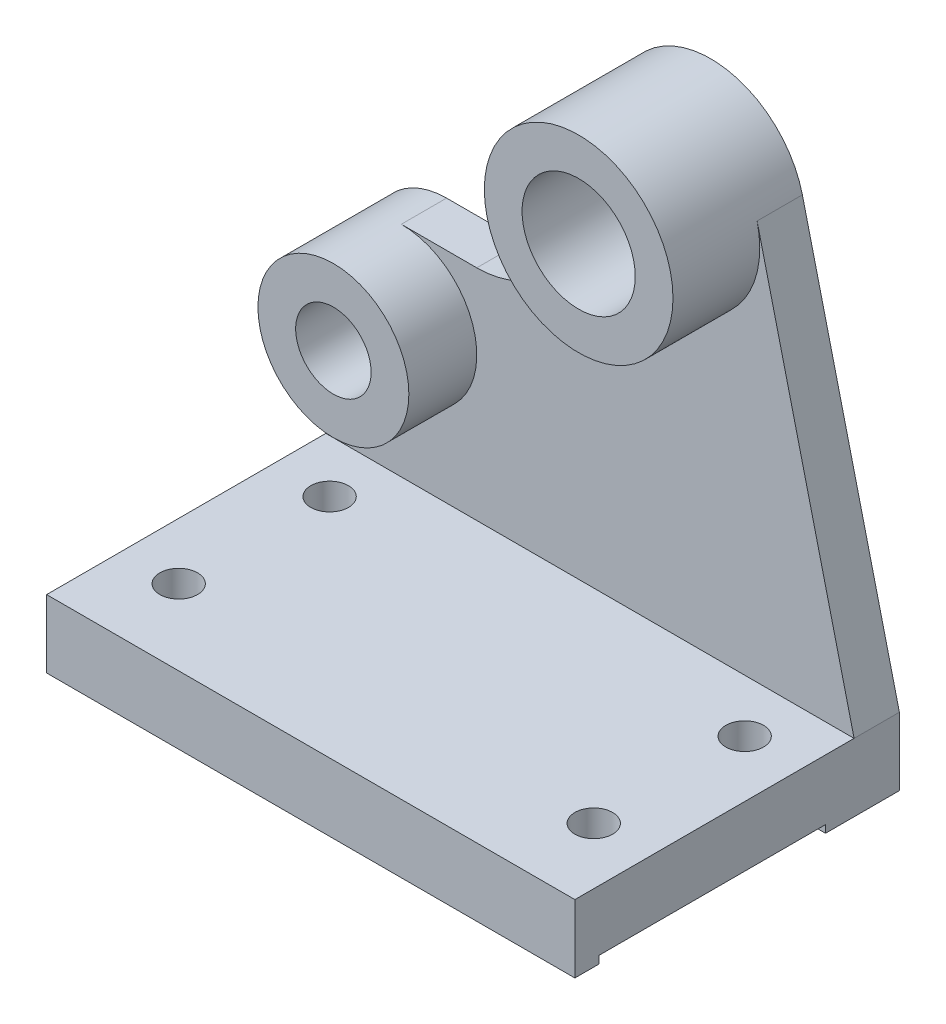
ISO-10303-21;
HEADER;
FILE_DESCRIPTION(('STEP AP214'),'2;1');
FILE_NAME('part.step','',(''),(''),'','','');
FILE_SCHEMA(('AUTOMOTIVE_DESIGN { 1 0 10303 214 1 1 1 1 }'));
ENDSEC;
DATA;
#1=APPLICATION_CONTEXT('core data for automotive mechanical design processes');
#2=APPLICATION_PROTOCOL_DEFINITION('international standard','automotive_design',2000,#1);
#3=PRODUCT_CONTEXT('',#1,'mechanical');
#4=PRODUCT('Part','Part','',(#3));
#5=PRODUCT_RELATED_PRODUCT_CATEGORY('part','',(#4));
#6=PRODUCT_DEFINITION_FORMATION('','',#4);
#7=PRODUCT_DEFINITION_CONTEXT('part definition',#1,'design');
#8=PRODUCT_DEFINITION('design','',#6,#7);
#9=PRODUCT_DEFINITION_SHAPE('','',#8);
#10=(LENGTH_UNIT() NAMED_UNIT(*) SI_UNIT(.MILLI.,.METRE.));
#11=(NAMED_UNIT(*) PLANE_ANGLE_UNIT() SI_UNIT($,.RADIAN.));
#12=(NAMED_UNIT(*) SI_UNIT($,.STERADIAN.) SOLID_ANGLE_UNIT());
#13=UNCERTAINTY_MEASURE_WITH_UNIT(LENGTH_MEASURE(1.E-05),#10,'distance_accuracy_value','');
#14=(GEOMETRIC_REPRESENTATION_CONTEXT(3) GLOBAL_UNCERTAINTY_ASSIGNED_CONTEXT((#13)) GLOBAL_UNIT_ASSIGNED_CONTEXT((#10,
#11,#12)) REPRESENTATION_CONTEXT('',''));
#15=CARTESIAN_POINT('',(0.,0.,0.));
#16=DIRECTION('',(0.,0.,1.));
#17=DIRECTION('',(1.,0.,0.));
#18=AXIS2_PLACEMENT_3D('',#15,#16,#17);
#19=CARTESIAN_POINT('',(-70.,-18.,86.));
#20=DIRECTION('',(0.,1.,0.));
#21=DIRECTION('',(0.,0.,1.));
#22=AXIS2_PLACEMENT_3D('',#19,#20,#21);
#23=PLANE('',#22);
#24=DIRECTION('',(0.,0.,-1.));
#25=VECTOR('',#24,1.);
#26=CARTESIAN_POINT('',(-70.,-18.,86.));
#27=LINE('',#26,#25);
#28=CARTESIAN_POINT('',(-70.,-18.,86.));
#29=VERTEX_POINT('',#28);
#30=CARTESIAN_POINT('',(-70.,-18.,79.5757049373885));
#31=VERTEX_POINT('',#30);
#32=EDGE_CURVE('E184',#29,#31,#27,.T.);
#33=ORIENTED_EDGE('',*,*,#32,.T.);
#34=DIRECTION('',(1.,0.,0.));
#35=VECTOR('',#34,1.);
#36=CARTESIAN_POINT('',(-70.,-18.,79.5757049373885));
#37=LINE('',#36,#35);
#38=CARTESIAN_POINT('',(70.,-18.,79.5757049373885));
#39=VERTEX_POINT('',#38);
#40=EDGE_CURVE('E11',#31,#39,#37,.T.);
#41=ORIENTED_EDGE('',*,*,#40,.T.);
#42=DIRECTION('',(0.,0.,-1.));
#43=VECTOR('',#42,1.);
#44=CARTESIAN_POINT('',(70.,-18.,86.));
#45=LINE('',#44,#43);
#46=CARTESIAN_POINT('',(70.,-18.,86.));
#47=VERTEX_POINT('',#46);
#48=EDGE_CURVE('E349',#47,#39,#45,.T.);
#49=ORIENTED_EDGE('',*,*,#48,.F.);
#50=DIRECTION('',(1.,0.,0.));
#51=VECTOR('',#50,1.);
#52=CARTESIAN_POINT('',(-70.,-18.,86.));
#53=LINE('',#52,#51);
#54=EDGE_CURVE('E322',#29,#47,#53,.T.);
#55=ORIENTED_EDGE('',*,*,#54,.F.);
#56=EDGE_LOOP('',(#33,#41,#49,#55));
#57=FACE_BOUND('',#56,.T.);
#58=ADVANCED_FACE('F44',(#57),#23,.F.);
#59=CARTESIAN_POINT('',(70.,0.,86.));
#60=DIRECTION('',(-1.,0.,0.));
#61=DIRECTION('',(0.,0.,1.));
#62=AXIS2_PLACEMENT_3D('',#59,#60,#61);
#63=PLANE('',#62);
#64=DIRECTION('',(0.,-1.,0.));
#65=VECTOR('',#64,1.);
#66=CARTESIAN_POINT('',(70.,-16.,79.5757049373885));
#67=LINE('',#66,#65);
#68=CARTESIAN_POINT('',(70.,-16.,79.5757049373885));
#69=VERTEX_POINT('',#68);
#70=EDGE_CURVE('E176',#69,#39,#67,.T.);
#71=ORIENTED_EDGE('',*,*,#70,.F.);
#72=DIRECTION('',(0.,0.,1.));
#73=VECTOR('',#72,1.);
#74=CARTESIAN_POINT('',(70.,-16.,79.5757049373885));
#75=LINE('',#74,#73);
#76=CARTESIAN_POINT('',(70.,-16.,19.5757049373885));
#77=VERTEX_POINT('',#76);
#78=EDGE_CURVE('E177',#77,#69,#75,.T.);
#79=ORIENTED_EDGE('',*,*,#78,.F.);
#80=DIRECTION('',(0.,1.,0.));
#81=VECTOR('',#80,1.);
#82=CARTESIAN_POINT('',(70.,-16.,19.5757049373885));
#83=LINE('',#82,#81);
#84=CARTESIAN_POINT('',(70.,-18.,19.5757049373885));
#85=VERTEX_POINT('',#84);
#86=EDGE_CURVE('E154',#85,#77,#83,.T.);
#87=ORIENTED_EDGE('',*,*,#86,.F.);
#88=CARTESIAN_POINT('',(70.,-18.,0.));
#89=VERTEX_POINT('',#88);
#90=EDGE_CURVE('E346',#85,#89,#45,.T.);
#91=ORIENTED_EDGE('',*,*,#90,.T.);
#92=DIRECTION('',(0.,1.,0.));
#93=VECTOR('',#92,1.);
#94=CARTESIAN_POINT('',(70.,0.,0.));
#95=LINE('',#94,#93);
#96=CARTESIAN_POINT('',(70.,0.,0.));
#97=VERTEX_POINT('',#96);
#98=EDGE_CURVE('E324',#89,#97,#95,.T.);
#99=ORIENTED_EDGE('',*,*,#98,.T.);
#100=DIRECTION('',(0.,0.,-1.));
#101=VECTOR('',#100,1.);
#102=CARTESIAN_POINT('',(70.,0.,12.));
#103=LINE('',#102,#101);
#104=CARTESIAN_POINT('',(70.,0.,12.));
#105=VERTEX_POINT('',#104);
#106=EDGE_CURVE('E301',#105,#97,#103,.T.);
#107=ORIENTED_EDGE('',*,*,#106,.F.);
#108=DIRECTION('',(0.,0.,-1.));
#109=VECTOR('',#108,1.);
#110=CARTESIAN_POINT('',(70.,0.,86.));
#111=LINE('',#110,#109);
#112=CARTESIAN_POINT('',(70.,0.,86.));
#113=VERTEX_POINT('',#112);
#114=EDGE_CURVE('E343',#113,#105,#111,.T.);
#115=ORIENTED_EDGE('',*,*,#114,.F.);
#116=DIRECTION('',(0.,1.,0.));
#117=VECTOR('',#116,1.);
#118=CARTESIAN_POINT('',(70.,0.,86.));
#119=LINE('',#118,#117);
#120=EDGE_CURVE('E327',#47,#113,#119,.T.);
#121=ORIENTED_EDGE('',*,*,#120,.F.);
#122=ORIENTED_EDGE('',*,*,#48,.T.);
#123=EDGE_LOOP('',(#71,#79,#87,#91,#99,#107,#115,#121,#122));
#124=FACE_BOUND('',#123,.T.);
#125=ADVANCED_FACE('F364',(#124),#63,.F.);
#126=CARTESIAN_POINT('',(-70.,0.,86.));
#127=DIRECTION('',(0.,-1.,0.));
#128=DIRECTION('',(0.,0.,-1.));
#129=AXIS2_PLACEMENT_3D('',#126,#127,#128);
#130=PLANE('',#129);
#131=CARTESIAN_POINT('',(55.,0.,66.));
#132=DIRECTION('',(0.,1.,0.));
#133=DIRECTION('',(0.,0.,1.));
#134=AXIS2_PLACEMENT_3D('',#131,#132,#133);
#135=CIRCLE('',#134,5.);
#136=CARTESIAN_POINT('',(55.,0.,71.));
#137=VERTEX_POINT('',#136);
#138=EDGE_CURVE('E205',#137,#137,#135,.T.);
#139=ORIENTED_EDGE('',*,*,#138,.F.);
#140=EDGE_LOOP('',(#139));
#141=FACE_BOUND('',#140,.T.);
#142=CARTESIAN_POINT('',(55.,0.,26.));
#143=DIRECTION('',(0.,1.,0.));
#144=DIRECTION('',(0.,0.,1.));
#145=AXIS2_PLACEMENT_3D('',#142,#143,#144);
#146=CIRCLE('',#145,5.);
#147=CARTESIAN_POINT('',(55.,0.,31.));
#148=VERTEX_POINT('',#147);
#149=EDGE_CURVE('E208',#148,#148,#146,.T.);
#150=ORIENTED_EDGE('',*,*,#149,.F.);
#151=EDGE_LOOP('',(#150));
#152=FACE_BOUND('',#151,.T.);
#153=CARTESIAN_POINT('',(-55.,0.,26.));
#154=DIRECTION('',(0.,1.,0.));
#155=DIRECTION('',(0.,0.,1.));
#156=AXIS2_PLACEMENT_3D('',#153,#154,#155);
#157=CIRCLE('',#156,5.);
#158=CARTESIAN_POINT('',(-55.,0.,31.));
#159=VERTEX_POINT('',#158);
#160=EDGE_CURVE('E201',#159,#159,#157,.T.);
#161=ORIENTED_EDGE('',*,*,#160,.F.);
#162=EDGE_LOOP('',(#161));
#163=FACE_BOUND('',#162,.T.);
#164=CARTESIAN_POINT('',(-55.,0.,66.));
#165=DIRECTION('',(0.,1.,0.));
#166=DIRECTION('',(0.,0.,1.));
#167=AXIS2_PLACEMENT_3D('',#164,#165,#166);
#168=CIRCLE('',#167,5.);
#169=CARTESIAN_POINT('',(-55.,0.,71.));
#170=VERTEX_POINT('',#169);
#171=EDGE_CURVE('E210',#170,#170,#168,.T.);
#172=ORIENTED_EDGE('',*,*,#171,.F.);
#173=EDGE_LOOP('',(#172));
#174=FACE_BOUND('',#173,.T.);
#175=DIRECTION('',(1.,0.,0.));
#176=VECTOR('',#175,1.);
#177=CARTESIAN_POINT('',(0.,0.,12.));
#178=LINE('',#177,#176);
#179=CARTESIAN_POINT('',(-70.,0.,12.));
#180=VERTEX_POINT('',#179);
#181=EDGE_CURVE('E66',#180,#105,#178,.T.);
#182=ORIENTED_EDGE('',*,*,#181,.F.);
#183=DIRECTION('',(0.,0.,-1.));
#184=VECTOR('',#183,1.);
#185=CARTESIAN_POINT('',(-70.,0.,86.));
#186=LINE('',#185,#184);
#187=CARTESIAN_POINT('',(-70.,0.,86.));
#188=VERTEX_POINT('',#187);
#189=EDGE_CURVE('E331',#188,#180,#186,.T.);
#190=ORIENTED_EDGE('',*,*,#189,.F.);
#191=DIRECTION('',(-1.,0.,0.));
#192=VECTOR('',#191,1.);
#193=CARTESIAN_POINT('',(-70.,0.,86.));
#194=LINE('',#193,#192);
#195=EDGE_CURVE('E332',#113,#188,#194,.T.);
#196=ORIENTED_EDGE('',*,*,#195,.F.);
#197=ORIENTED_EDGE('',*,*,#114,.T.);
#198=EDGE_LOOP('',(#182,#190,#196,#197));
#199=FACE_BOUND('',#198,.T.);
#200=ADVANCED_FACE('F378',(#141,#152,#163,#174,#199),#130,.F.);
#201=CARTESIAN_POINT('',(-70.,0.,86.));
#202=DIRECTION('',(1.,0.,0.));
#203=DIRECTION('',(0.,0.,-1.));
#204=AXIS2_PLACEMENT_3D('',#201,#202,#203);
#205=PLANE('',#204);
#206=DIRECTION('',(0.,0.,1.));
#207=VECTOR('',#206,1.);
#208=CARTESIAN_POINT('',(-70.,-16.,79.5757049373885));
#209=LINE('',#208,#207);
#210=CARTESIAN_POINT('',(-70.,-16.,19.5757049373885));
#211=VERTEX_POINT('',#210);
#212=CARTESIAN_POINT('',(-70.,-16.,79.5757049373885));
#213=VERTEX_POINT('',#212);
#214=EDGE_CURVE('E157',#211,#213,#209,.T.);
#215=ORIENTED_EDGE('',*,*,#214,.T.);
#216=DIRECTION('',(0.,-1.,0.));
#217=VECTOR('',#216,1.);
#218=CARTESIAN_POINT('',(-70.,-16.,79.5757049373885));
#219=LINE('',#218,#217);
#220=EDGE_CURVE('E172',#213,#31,#219,.T.);
#221=ORIENTED_EDGE('',*,*,#220,.T.);
#222=ORIENTED_EDGE('',*,*,#32,.F.);
#223=DIRECTION('',(0.,-1.,0.));
#224=VECTOR('',#223,1.);
#225=CARTESIAN_POINT('',(-70.,0.,86.));
#226=LINE('',#225,#224);
#227=EDGE_CURVE('E319',#188,#29,#226,.T.);
#228=ORIENTED_EDGE('',*,*,#227,.F.);
#229=ORIENTED_EDGE('',*,*,#189,.T.);
#230=DIRECTION('',(0.,1.,0.));
#231=VECTOR('',#230,1.);
#232=CARTESIAN_POINT('',(-70.,0.,12.));
#233=LINE('',#232,#231);
#234=CARTESIAN_POINT('',(-70.,38.,12.));
#235=VERTEX_POINT('',#234);
#236=EDGE_CURVE('E262',#180,#235,#233,.T.);
#237=ORIENTED_EDGE('',*,*,#236,.T.);
#238=DIRECTION('',(0.,0.,-1.));
#239=VECTOR('',#238,1.);
#240=CARTESIAN_POINT('',(-70.,38.,12.));
#241=LINE('',#240,#239);
#242=CARTESIAN_POINT('',(-70.,38.,0.));
#243=VERTEX_POINT('',#242);
#244=EDGE_CURVE('E306',#235,#243,#241,.T.);
#245=ORIENTED_EDGE('',*,*,#244,.T.);
#246=DIRECTION('',(0.,-1.,0.));
#247=VECTOR('',#246,1.);
#248=CARTESIAN_POINT('',(-70.,0.,0.));
#249=LINE('',#248,#247);
#250=CARTESIAN_POINT('',(-70.,-18.,0.));
#251=VERTEX_POINT('',#250);
#252=EDGE_CURVE('E317',#243,#251,#249,.T.);
#253=ORIENTED_EDGE('',*,*,#252,.T.);
#254=CARTESIAN_POINT('',(-70.,-18.,19.5757049373885));
#255=VERTEX_POINT('',#254);
#256=EDGE_CURVE('E171',#255,#251,#27,.T.);
#257=ORIENTED_EDGE('',*,*,#256,.F.);
#258=DIRECTION('',(0.,1.,0.));
#259=VECTOR('',#258,1.);
#260=CARTESIAN_POINT('',(-70.,-16.,19.5757049373885));
#261=LINE('',#260,#259);
#262=EDGE_CURVE('E155',#255,#211,#261,.T.);
#263=ORIENTED_EDGE('',*,*,#262,.T.);
#264=EDGE_LOOP('',(#215,#221,#222,#228,#229,#237,#245,#253,#257,#263));
#265=FACE_BOUND('',#264,.T.);
#266=ADVANCED_FACE('F50',(#265),#205,.F.);
#267=ORIENTED_EDGE('',*,*,#90,.F.);
#268=DIRECTION('',(-1.,0.,0.));
#269=VECTOR('',#268,1.);
#270=CARTESIAN_POINT('',(-70.,-18.,19.5757049373885));
#271=LINE('',#270,#269);
#272=EDGE_CURVE('E53',#85,#255,#271,.T.);
#273=ORIENTED_EDGE('',*,*,#272,.T.);
#274=ORIENTED_EDGE('',*,*,#256,.T.);
#275=DIRECTION('',(1.,0.,0.));
#276=VECTOR('',#275,1.);
#277=CARTESIAN_POINT('',(-70.,-18.,0.));
#278=LINE('',#277,#276);
#279=EDGE_CURVE('E340',#251,#89,#278,.T.);
#280=ORIENTED_EDGE('',*,*,#279,.T.);
#281=EDGE_LOOP('',(#267,#273,#274,#280));
#282=FACE_BOUND('',#281,.T.);
#283=ADVANCED_FACE('F363',(#282),#23,.F.);
#284=CARTESIAN_POINT('',(0.,0.,86.));
#285=DIRECTION('',(0.,0.,1.));
#286=DIRECTION('',(1.,0.,0.));
#287=AXIS2_PLACEMENT_3D('',#284,#285,#286);
#288=PLANE('',#287);
#289=ORIENTED_EDGE('',*,*,#227,.T.);
#290=ORIENTED_EDGE('',*,*,#54,.T.);
#291=ORIENTED_EDGE('',*,*,#120,.T.);
#292=ORIENTED_EDGE('',*,*,#195,.T.);
#293=EDGE_LOOP('',(#289,#290,#291,#292));
#294=FACE_BOUND('',#293,.T.);
#295=ADVANCED_FACE('F374',(#294),#288,.T.);
#296=CARTESIAN_POINT('',(0.,0.,0.));
#297=DIRECTION('',(0.,0.,1.));
#298=DIRECTION('',(1.,0.,0.));
#299=AXIS2_PLACEMENT_3D('',#296,#297,#298);
#300=PLANE('',#299);
#301=ORIENTED_EDGE('',*,*,#252,.F.);
#302=CARTESIAN_POINT('',(-50.,38.,0.));
#303=DIRECTION('',(0.,0.,1.));
#304=DIRECTION('',(1.,0.,0.));
#305=AXIS2_PLACEMENT_3D('',#302,#303,#304);
#306=CIRCLE('',#305,20.);
#307=CARTESIAN_POINT('',(-50.,58.,0.));
#308=VERTEX_POINT('',#307);
#309=EDGE_CURVE('E221',#308,#243,#306,.T.);
#310=ORIENTED_EDGE('',*,*,#309,.F.);
#311=DIRECTION('',(1.,0.,0.));
#312=VECTOR('',#311,1.);
#313=CARTESIAN_POINT('',(0.,58.,0.));
#314=LINE('',#313,#312);
#315=CARTESIAN_POINT('',(-30.,58.,0.));
#316=VERTEX_POINT('',#315);
#317=EDGE_CURVE('E284',#308,#316,#314,.T.);
#318=ORIENTED_EDGE('',*,*,#317,.T.);
#319=CARTESIAN_POINT('',(-30.,83.,0.));
#320=DIRECTION('',(0.,0.,1.));
#321=DIRECTION('',(1.,0.,0.));
#322=AXIS2_PLACEMENT_3D('',#319,#320,#321);
#323=CIRCLE('',#322,25.);
#324=CARTESIAN_POINT('',(-5.,83.,0.));
#325=VERTEX_POINT('',#324);
#326=EDGE_CURVE('E243',#316,#325,#323,.T.);
#327=ORIENTED_EDGE('',*,*,#326,.T.);
#328=DIRECTION('',(0.,-1.,0.));
#329=VECTOR('',#328,1.);
#330=CARTESIAN_POINT('',(-5.,0.,0.));
#331=LINE('',#330,#329);
#332=CARTESIAN_POINT('',(-5.,100.,0.));
#333=VERTEX_POINT('',#332);
#334=EDGE_CURVE('E258',#333,#325,#331,.T.);
#335=ORIENTED_EDGE('',*,*,#334,.F.);
#336=CARTESIAN_POINT('',(20.,100.,0.));
#337=DIRECTION('',(0.,0.,1.));
#338=DIRECTION('',(1.,0.,0.));
#339=AXIS2_PLACEMENT_3D('',#336,#337,#338);
#340=CIRCLE('',#339,25.);
#341=CARTESIAN_POINT('',(44.2944947177034,105.897247358852,0.));
#342=VERTEX_POINT('',#341);
#343=EDGE_CURVE('E238',#342,#333,#340,.T.);
#344=ORIENTED_EDGE('',*,*,#343,.F.);
#345=DIRECTION('',(-0.235889894354067,0.971779788708135,0.));
#346=VECTOR('',#345,1.);
#347=CARTESIAN_POINT('',(66.1049170419139,16.0463122185646,0.));
#348=LINE('',#347,#346);
#349=EDGE_CURVE('E286',#97,#342,#348,.T.);
#350=ORIENTED_EDGE('',*,*,#349,.F.);
#351=ORIENTED_EDGE('',*,*,#98,.F.);
#352=ORIENTED_EDGE('',*,*,#279,.F.);
#353=EDGE_LOOP('',(#301,#310,#318,#327,#335,#344,#350,#351,#352));
#354=FACE_BOUND('',#353,.T.);
#355=CARTESIAN_POINT('',(20.,100.,0.));
#356=DIRECTION('',(0.,0.,1.));
#357=DIRECTION('',(1.,0.,0.));
#358=AXIS2_PLACEMENT_3D('',#355,#356,#357);
#359=CIRCLE('',#358,15.);
#360=CARTESIAN_POINT('',(35.,100.,0.));
#361=VERTEX_POINT('',#360);
#362=EDGE_CURVE('E227',#361,#361,#359,.T.);
#363=ORIENTED_EDGE('',*,*,#362,.T.);
#364=EDGE_LOOP('',(#363));
#365=FACE_BOUND('',#364,.T.);
#366=CARTESIAN_POINT('',(-50.,38.,0.));
#367=DIRECTION('',(0.,0.,1.));
#368=DIRECTION('',(1.,0.,0.));
#369=AXIS2_PLACEMENT_3D('',#366,#367,#368);
#370=CIRCLE('',#369,10.);
#371=CARTESIAN_POINT('',(-40.,38.,0.));
#372=VERTEX_POINT('',#371);
#373=EDGE_CURVE('E217',#372,#372,#370,.T.);
#374=ORIENTED_EDGE('',*,*,#373,.T.);
#375=EDGE_LOOP('',(#374));
#376=FACE_BOUND('',#375,.T.);
#377=ADVANCED_FACE('F396',(#354,#365,#376),#300,.F.);
#378=CARTESIAN_POINT('',(-30.,83.,12.));
#379=DIRECTION('',(0.,0.,-1.));
#380=DIRECTION('',(-1.,0.,0.));
#381=AXIS2_PLACEMENT_3D('',#378,#379,#380);
#382=CYLINDRICAL_SURFACE('',#381,25.);
#383=ORIENTED_EDGE('',*,*,#326,.F.);
#384=DIRECTION('',(0.,0.,-1.));
#385=VECTOR('',#384,1.);
#386=CARTESIAN_POINT('',(-30.,58.,12.));
#387=LINE('',#386,#385);
#388=CARTESIAN_POINT('',(-30.,58.,12.));
#389=VERTEX_POINT('',#388);
#390=EDGE_CURVE('E316',#389,#316,#387,.T.);
#391=ORIENTED_EDGE('',*,*,#390,.F.);
#392=CARTESIAN_POINT('',(-30.,83.,12.));
#393=DIRECTION('',(0.,0.,1.));
#394=DIRECTION('',(1.,0.,0.));
#395=AXIS2_PLACEMENT_3D('',#392,#393,#394);
#396=CIRCLE('',#395,25.);
#397=CARTESIAN_POINT('',(-5.,83.,12.));
#398=VERTEX_POINT('',#397);
#399=EDGE_CURVE('E253',#389,#398,#396,.T.);
#400=ORIENTED_EDGE('',*,*,#399,.T.);
#401=DIRECTION('',(0.,0.,-1.));
#402=VECTOR('',#401,1.);
#403=CARTESIAN_POINT('',(-5.,83.,12.));
#404=LINE('',#403,#402);
#405=EDGE_CURVE('E281',#398,#325,#404,.T.);
#406=ORIENTED_EDGE('',*,*,#405,.T.);
#407=EDGE_LOOP('',(#383,#391,#400,#406));
#408=FACE_BOUND('',#407,.T.);
#409=ADVANCED_FACE('F403',(#408),#382,.F.);
#410=CARTESIAN_POINT('',(0.,58.,12.));
#411=DIRECTION('',(0.,1.,0.));
#412=DIRECTION('',(0.,0.,1.));
#413=AXIS2_PLACEMENT_3D('',#410,#411,#412);
#414=PLANE('',#413);
#415=ORIENTED_EDGE('',*,*,#317,.F.);
#416=DIRECTION('',(0.,0.,-1.));
#417=VECTOR('',#416,1.);
#418=CARTESIAN_POINT('',(-50.,58.,12.));
#419=LINE('',#418,#417);
#420=CARTESIAN_POINT('',(-50.,58.,12.));
#421=VERTEX_POINT('',#420);
#422=EDGE_CURVE('E315',#421,#308,#419,.T.);
#423=ORIENTED_EDGE('',*,*,#422,.F.);
#424=DIRECTION('',(1.,0.,0.));
#425=VECTOR('',#424,1.);
#426=CARTESIAN_POINT('',(0.,58.,12.));
#427=LINE('',#426,#425);
#428=EDGE_CURVE('E254',#421,#389,#427,.T.);
#429=ORIENTED_EDGE('',*,*,#428,.T.);
#430=ORIENTED_EDGE('',*,*,#390,.T.);
#431=EDGE_LOOP('',(#415,#423,#429,#430));
#432=FACE_BOUND('',#431,.T.);
#433=ADVANCED_FACE('F408',(#432),#414,.T.);
#434=CARTESIAN_POINT('',(66.1049170419139,16.0463122185646,12.));
#435=DIRECTION('',(-0.971779788708135,-0.235889894354067,0.));
#436=DIRECTION('',(0.235889894354067,-0.971779788708135,0.));
#437=AXIS2_PLACEMENT_3D('',#434,#435,#436);
#438=PLANE('',#437);
#439=ORIENTED_EDGE('',*,*,#349,.T.);
#440=DIRECTION('',(0.,0.,-1.));
#441=VECTOR('',#440,1.);
#442=CARTESIAN_POINT('',(44.2944947177034,105.897247358852,12.));
#443=LINE('',#442,#441);
#444=CARTESIAN_POINT('',(44.2944947177034,105.897247358852,12.));
#445=VERTEX_POINT('',#444);
#446=EDGE_CURVE('E299',#445,#342,#443,.T.);
#447=ORIENTED_EDGE('',*,*,#446,.F.);
#448=DIRECTION('',(-0.235889894354067,0.971779788708135,0.));
#449=VECTOR('',#448,1.);
#450=CARTESIAN_POINT('',(66.1049170419139,16.0463122185646,12.));
#451=LINE('',#450,#449);
#452=EDGE_CURVE('E269',#105,#445,#451,.T.);
#453=ORIENTED_EDGE('',*,*,#452,.F.);
#454=ORIENTED_EDGE('',*,*,#106,.T.);
#455=EDGE_LOOP('',(#439,#447,#453,#454));
#456=FACE_BOUND('',#455,.T.);
#457=ADVANCED_FACE('F414',(#456),#438,.F.);
#458=CARTESIAN_POINT('',(-5.,0.,12.));
#459=DIRECTION('',(1.,0.,0.));
#460=DIRECTION('',(0.,0.,-1.));
#461=AXIS2_PLACEMENT_3D('',#458,#459,#460);
#462=PLANE('',#461);
#463=ORIENTED_EDGE('',*,*,#334,.T.);
#464=ORIENTED_EDGE('',*,*,#405,.F.);
#465=DIRECTION('',(0.,-1.,0.));
#466=VECTOR('',#465,1.);
#467=CARTESIAN_POINT('',(-5.,0.,12.));
#468=LINE('',#467,#466);
#469=CARTESIAN_POINT('',(-5.,100.,12.));
#470=VERTEX_POINT('',#469);
#471=EDGE_CURVE('E279',#470,#398,#468,.T.);
#472=ORIENTED_EDGE('',*,*,#471,.F.);
#473=DIRECTION('',(0.,0.,-1.));
#474=VECTOR('',#473,1.);
#475=CARTESIAN_POINT('',(-5.,100.,12.));
#476=LINE('',#475,#474);
#477=EDGE_CURVE('E300',#470,#333,#476,.T.);
#478=ORIENTED_EDGE('',*,*,#477,.T.);
#479=EDGE_LOOP('',(#463,#464,#472,#478));
#480=FACE_BOUND('',#479,.T.);
#481=ADVANCED_FACE('F417',(#480),#462,.F.);
#482=CARTESIAN_POINT('',(0.,0.,12.));
#483=DIRECTION('',(0.,0.,1.));
#484=DIRECTION('',(1.,0.,0.));
#485=AXIS2_PLACEMENT_3D('',#482,#483,#484);
#486=PLANE('',#485);
#487=ORIENTED_EDGE('',*,*,#399,.F.);
#488=ORIENTED_EDGE('',*,*,#428,.F.);
#489=CARTESIAN_POINT('',(-50.,38.,12.));
#490=DIRECTION('',(0.,0.,1.));
#491=DIRECTION('',(1.,0.,0.));
#492=AXIS2_PLACEMENT_3D('',#489,#490,#491);
#493=CIRCLE('',#492,20.);
#494=EDGE_CURVE('E257',#235,#421,#493,.T.);
#495=ORIENTED_EDGE('',*,*,#494,.F.);
#496=ORIENTED_EDGE('',*,*,#236,.F.);
#497=ORIENTED_EDGE('',*,*,#181,.T.);
#498=ORIENTED_EDGE('',*,*,#452,.T.);
#499=CARTESIAN_POINT('',(20.,100.,12.));
#500=DIRECTION('',(0.,0.,1.));
#501=DIRECTION('',(1.,0.,0.));
#502=AXIS2_PLACEMENT_3D('',#499,#500,#501);
#503=CIRCLE('',#502,25.);
#504=EDGE_CURVE('E273',#470,#445,#503,.T.);
#505=ORIENTED_EDGE('',*,*,#504,.F.);
#506=ORIENTED_EDGE('',*,*,#471,.T.);
#507=EDGE_LOOP('',(#487,#488,#495,#496,#497,#498,#505,#506));
#508=FACE_BOUND('',#507,.T.);
#509=ADVANCED_FACE('F423',(#508),#486,.T.);
#510=CARTESIAN_POINT('',(20.,100.,35.));
#511=DIRECTION('',(0.,0.,-1.));
#512=DIRECTION('',(-1.,0.,0.));
#513=AXIS2_PLACEMENT_3D('',#510,#511,#512);
#514=CYLINDRICAL_SURFACE('',#513,15.);
#515=CARTESIAN_POINT('',(20.,100.,35.));
#516=DIRECTION('',(0.,0.,1.));
#517=DIRECTION('',(1.,0.,0.));
#518=AXIS2_PLACEMENT_3D('',#515,#516,#517);
#519=CIRCLE('',#518,15.);
#520=CARTESIAN_POINT('',(35.,100.,35.));
#521=VERTEX_POINT('',#520);
#522=EDGE_CURVE('E233',#521,#521,#519,.T.);
#523=ORIENTED_EDGE('',*,*,#522,.T.);
#524=EDGE_LOOP('',(#523));
#525=FACE_BOUND('',#524,.T.);
#526=ORIENTED_EDGE('',*,*,#362,.F.);
#527=EDGE_LOOP('',(#526));
#528=FACE_BOUND('',#527,.T.);
#529=ADVANCED_FACE('F422',(#525,#528),#514,.F.);
#530=CARTESIAN_POINT('',(20.,100.,35.));
#531=DIRECTION('',(0.,0.,-1.));
#532=DIRECTION('',(-1.,0.,0.));
#533=AXIS2_PLACEMENT_3D('',#530,#531,#532);
#534=CYLINDRICAL_SURFACE('',#533,25.);
#535=ORIENTED_EDGE('',*,*,#477,.F.);
#536=ORIENTED_EDGE('',*,*,#504,.T.);
#537=ORIENTED_EDGE('',*,*,#446,.T.);
#538=ORIENTED_EDGE('',*,*,#343,.T.);
#539=EDGE_LOOP('',(#535,#536,#537,#538));
#540=FACE_BOUND('',#539,.T.);
#541=CARTESIAN_POINT('',(20.,100.,35.));
#542=DIRECTION('',(0.,0.,1.));
#543=DIRECTION('',(1.,0.,0.));
#544=AXIS2_PLACEMENT_3D('',#541,#542,#543);
#545=CIRCLE('',#544,25.);
#546=CARTESIAN_POINT('',(45.,100.,35.));
#547=VERTEX_POINT('',#546);
#548=EDGE_CURVE('E239',#547,#547,#545,.T.);
#549=ORIENTED_EDGE('',*,*,#548,.F.);
#550=EDGE_LOOP('',(#549));
#551=FACE_BOUND('',#550,.T.);
#552=ADVANCED_FACE('F427',(#540,#551),#534,.T.);
#553=CARTESIAN_POINT('',(0.,0.,35.));
#554=DIRECTION('',(0.,0.,1.));
#555=DIRECTION('',(1.,0.,0.));
#556=AXIS2_PLACEMENT_3D('',#553,#554,#555);
#557=PLANE('',#556);
#558=ORIENTED_EDGE('',*,*,#522,.F.);
#559=EDGE_LOOP('',(#558));
#560=FACE_BOUND('',#559,.T.);
#561=ORIENTED_EDGE('',*,*,#548,.T.);
#562=EDGE_LOOP('',(#561));
#563=FACE_BOUND('',#562,.T.);
#564=ADVANCED_FACE('F433',(#560,#563),#557,.T.);
#565=CARTESIAN_POINT('',(-50.,38.,30.));
#566=DIRECTION('',(0.,0.,-1.));
#567=DIRECTION('',(-1.,0.,0.));
#568=AXIS2_PLACEMENT_3D('',#565,#566,#567);
#569=CYLINDRICAL_SURFACE('',#568,10.);
#570=CARTESIAN_POINT('',(-50.,38.,30.));
#571=DIRECTION('',(0.,0.,1.));
#572=DIRECTION('',(1.,0.,0.));
#573=AXIS2_PLACEMENT_3D('',#570,#571,#572);
#574=CIRCLE('',#573,10.);
#575=CARTESIAN_POINT('',(-40.,38.,30.));
#576=VERTEX_POINT('',#575);
#577=EDGE_CURVE('E218',#576,#576,#574,.T.);
#578=ORIENTED_EDGE('',*,*,#577,.T.);
#579=EDGE_LOOP('',(#578));
#580=FACE_BOUND('',#579,.T.);
#581=ORIENTED_EDGE('',*,*,#373,.F.);
#582=EDGE_LOOP('',(#581));
#583=FACE_BOUND('',#582,.T.);
#584=ADVANCED_FACE('F440',(#580,#583),#569,.F.);
#585=CARTESIAN_POINT('',(-50.,38.,30.));
#586=DIRECTION('',(0.,0.,-1.));
#587=DIRECTION('',(-1.,0.,0.));
#588=AXIS2_PLACEMENT_3D('',#585,#586,#587);
#589=CYLINDRICAL_SURFACE('',#588,20.);
#590=ORIENTED_EDGE('',*,*,#244,.F.);
#591=ORIENTED_EDGE('',*,*,#494,.T.);
#592=ORIENTED_EDGE('',*,*,#422,.T.);
#593=ORIENTED_EDGE('',*,*,#309,.T.);
#594=EDGE_LOOP('',(#590,#591,#592,#593));
#595=FACE_BOUND('',#594,.T.);
#596=CARTESIAN_POINT('',(-50.,38.,30.));
#597=DIRECTION('',(0.,0.,1.));
#598=DIRECTION('',(1.,0.,0.));
#599=AXIS2_PLACEMENT_3D('',#596,#597,#598);
#600=CIRCLE('',#599,20.);
#601=CARTESIAN_POINT('',(-30.,38.,30.));
#602=VERTEX_POINT('',#601);
#603=EDGE_CURVE('E224',#602,#602,#600,.T.);
#604=ORIENTED_EDGE('',*,*,#603,.F.);
#605=EDGE_LOOP('',(#604));
#606=FACE_BOUND('',#605,.T.);
#607=ADVANCED_FACE('F442',(#595,#606),#589,.T.);
#608=CARTESIAN_POINT('',(0.,0.,30.));
#609=DIRECTION('',(0.,0.,1.));
#610=DIRECTION('',(1.,0.,0.));
#611=AXIS2_PLACEMENT_3D('',#608,#609,#610);
#612=PLANE('',#611);
#613=ORIENTED_EDGE('',*,*,#577,.F.);
#614=EDGE_LOOP('',(#613));
#615=FACE_BOUND('',#614,.T.);
#616=ORIENTED_EDGE('',*,*,#603,.T.);
#617=EDGE_LOOP('',(#616));
#618=FACE_BOUND('',#617,.T.);
#619=ADVANCED_FACE('F443',(#615,#618),#612,.T.);
#620=CARTESIAN_POINT('',(-55.,-18.,66.));
#621=DIRECTION('',(0.,1.,0.));
#622=DIRECTION('',(0.,0.,1.));
#623=AXIS2_PLACEMENT_3D('',#620,#621,#622);
#624=CYLINDRICAL_SURFACE('',#623,5.);
#625=CARTESIAN_POINT('',(-55.,-16.,66.));
#626=DIRECTION('',(0.,1.,0.));
#627=DIRECTION('',(0.,0.,1.));
#628=AXIS2_PLACEMENT_3D('',#625,#626,#627);
#629=CIRCLE('',#628,5.);
#630=CARTESIAN_POINT('',(-55.,-16.,71.));
#631=VERTEX_POINT('',#630);
#632=EDGE_CURVE('E196',#631,#631,#629,.F.);
#633=ORIENTED_EDGE('',*,*,#632,.T.);
#634=EDGE_LOOP('',(#633));
#635=FACE_BOUND('',#634,.T.);
#636=ORIENTED_EDGE('',*,*,#171,.T.);
#637=EDGE_LOOP('',(#636));
#638=FACE_BOUND('',#637,.T.);
#639=ADVANCED_FACE('F447',(#635,#638),#624,.F.);
#640=CARTESIAN_POINT('',(-55.,-18.,26.));
#641=DIRECTION('',(0.,1.,0.));
#642=DIRECTION('',(0.,0.,1.));
#643=AXIS2_PLACEMENT_3D('',#640,#641,#642);
#644=CYLINDRICAL_SURFACE('',#643,5.);
#645=CARTESIAN_POINT('',(-55.,-16.,26.));
#646=DIRECTION('',(0.,1.,0.));
#647=DIRECTION('',(0.,0.,1.));
#648=AXIS2_PLACEMENT_3D('',#645,#646,#647);
#649=CIRCLE('',#648,5.);
#650=CARTESIAN_POINT('',(-55.,-16.,31.));
#651=VERTEX_POINT('',#650);
#652=EDGE_CURVE('E191',#651,#651,#649,.F.);
#653=ORIENTED_EDGE('',*,*,#652,.T.);
#654=EDGE_LOOP('',(#653));
#655=FACE_BOUND('',#654,.T.);
#656=ORIENTED_EDGE('',*,*,#160,.T.);
#657=EDGE_LOOP('',(#656));
#658=FACE_BOUND('',#657,.T.);
#659=ADVANCED_FACE('F452',(#655,#658),#644,.F.);
#660=CARTESIAN_POINT('',(55.,-18.,26.));
#661=DIRECTION('',(0.,1.,0.));
#662=DIRECTION('',(0.,0.,1.));
#663=AXIS2_PLACEMENT_3D('',#660,#661,#662);
#664=CYLINDRICAL_SURFACE('',#663,5.);
#665=CARTESIAN_POINT('',(55.,-16.,26.));
#666=DIRECTION('',(0.,1.,0.));
#667=DIRECTION('',(0.,0.,1.));
#668=AXIS2_PLACEMENT_3D('',#665,#666,#667);
#669=CIRCLE('',#668,5.);
#670=CARTESIAN_POINT('',(55.,-16.,31.));
#671=VERTEX_POINT('',#670);
#672=EDGE_CURVE('E189',#671,#671,#669,.F.);
#673=ORIENTED_EDGE('',*,*,#672,.T.);
#674=EDGE_LOOP('',(#673));
#675=FACE_BOUND('',#674,.T.);
#676=ORIENTED_EDGE('',*,*,#149,.T.);
#677=EDGE_LOOP('',(#676));
#678=FACE_BOUND('',#677,.T.);
#679=ADVANCED_FACE('F457',(#675,#678),#664,.F.);
#680=CARTESIAN_POINT('',(55.,-18.,66.));
#681=DIRECTION('',(0.,1.,0.));
#682=DIRECTION('',(0.,0.,1.));
#683=AXIS2_PLACEMENT_3D('',#680,#681,#682);
#684=CYLINDRICAL_SURFACE('',#683,5.);
#685=CARTESIAN_POINT('',(55.,-16.,66.));
#686=DIRECTION('',(0.,1.,0.));
#687=DIRECTION('',(0.,0.,1.));
#688=AXIS2_PLACEMENT_3D('',#685,#686,#687);
#689=CIRCLE('',#688,5.);
#690=CARTESIAN_POINT('',(55.,-16.,71.));
#691=VERTEX_POINT('',#690);
#692=EDGE_CURVE('E187',#691,#691,#689,.F.);
#693=ORIENTED_EDGE('',*,*,#692,.T.);
#694=EDGE_LOOP('',(#693));
#695=FACE_BOUND('',#694,.T.);
#696=ORIENTED_EDGE('',*,*,#138,.T.);
#697=EDGE_LOOP('',(#696));
#698=FACE_BOUND('',#697,.T.);
#699=ADVANCED_FACE('F454',(#695,#698),#684,.F.);
#700=CARTESIAN_POINT('',(-70.,-16.,79.5757049373885));
#701=DIRECTION('',(0.,0.,1.));
#702=DIRECTION('',(1.,0.,0.));
#703=AXIS2_PLACEMENT_3D('',#700,#701,#702);
#704=PLANE('',#703);
#705=ORIENTED_EDGE('',*,*,#220,.F.);
#706=DIRECTION('',(1.,0.,0.));
#707=VECTOR('',#706,1.);
#708=CARTESIAN_POINT('',(-70.,-16.,79.5757049373885));
#709=LINE('',#708,#707);
#710=EDGE_CURVE('E158',#213,#69,#709,.T.);
#711=ORIENTED_EDGE('',*,*,#710,.T.);
#712=ORIENTED_EDGE('',*,*,#70,.T.);
#713=ORIENTED_EDGE('',*,*,#40,.F.);
#714=EDGE_LOOP('',(#705,#711,#712,#713));
#715=FACE_BOUND('',#714,.T.);
#716=ADVANCED_FACE('F369',(#715),#704,.F.);
#717=CARTESIAN_POINT('',(-70.,-16.,19.5757049373885));
#718=DIRECTION('',(0.,0.,-1.));
#719=DIRECTION('',(-1.,0.,0.));
#720=AXIS2_PLACEMENT_3D('',#717,#718,#719);
#721=PLANE('',#720);
#722=ORIENTED_EDGE('',*,*,#86,.T.);
#723=DIRECTION('',(1.,0.,0.));
#724=VECTOR('',#723,1.);
#725=CARTESIAN_POINT('',(-70.,-16.,19.5757049373885));
#726=LINE('',#725,#724);
#727=EDGE_CURVE('E61',#211,#77,#726,.T.);
#728=ORIENTED_EDGE('',*,*,#727,.F.);
#729=ORIENTED_EDGE('',*,*,#262,.F.);
#730=ORIENTED_EDGE('',*,*,#272,.F.);
#731=EDGE_LOOP('',(#722,#728,#729,#730));
#732=FACE_BOUND('',#731,.T.);
#733=ADVANCED_FACE('F147',(#732),#721,.F.);
#734=CARTESIAN_POINT('',(-70.,-16.,79.5757049373885));
#735=DIRECTION('',(0.,1.,0.));
#736=DIRECTION('',(0.,0.,1.));
#737=AXIS2_PLACEMENT_3D('',#734,#735,#736);
#738=PLANE('',#737);
#739=ORIENTED_EDGE('',*,*,#652,.F.);
#740=EDGE_LOOP('',(#739));
#741=FACE_BOUND('',#740,.T.);
#742=ORIENTED_EDGE('',*,*,#692,.F.);
#743=EDGE_LOOP('',(#742));
#744=FACE_BOUND('',#743,.T.);
#745=ORIENTED_EDGE('',*,*,#78,.T.);
#746=ORIENTED_EDGE('',*,*,#710,.F.);
#747=ORIENTED_EDGE('',*,*,#214,.F.);
#748=ORIENTED_EDGE('',*,*,#727,.T.);
#749=EDGE_LOOP('',(#745,#746,#747,#748));
#750=FACE_BOUND('',#749,.T.);
#751=ORIENTED_EDGE('',*,*,#672,.F.);
#752=EDGE_LOOP('',(#751));
#753=FACE_BOUND('',#752,.T.);
#754=ORIENTED_EDGE('',*,*,#632,.F.);
#755=EDGE_LOOP('',(#754));
#756=FACE_BOUND('',#755,.T.);
#757=ADVANCED_FACE('F165',(#741,#744,#750,#753,#756),#738,.F.);
#758=CLOSED_SHELL('',(#58,#125,#200,#266,#283,#295,#377,#409,#433,#457,#481,#509,#529,#552,#564,
#584,#607,#619,#639,#659,#679,#699,#716,#733,#757));
#759=MANIFOLD_SOLID_BREP('B2',#758);
#760=ADVANCED_BREP_SHAPE_REPRESENTATION('',(#18,#759),#14);
#761=SHAPE_DEFINITION_REPRESENTATION(#9,#760);
ENDSEC;
END-ISO-10303-21;
